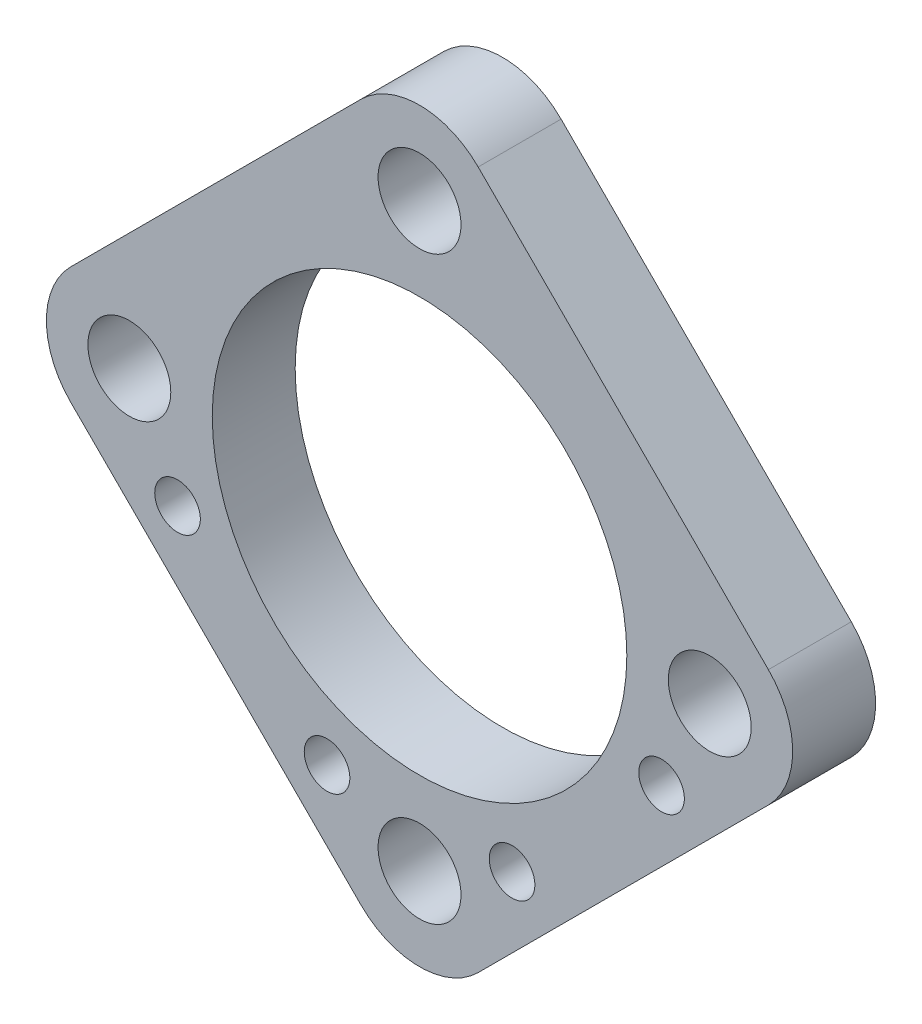
ISO-10303-21;
HEADER;
FILE_DESCRIPTION(('STEP AP214'),'2;1');
FILE_NAME('part.step','',(''),(''),'','','');
FILE_SCHEMA(('AUTOMOTIVE_DESIGN { 1 0 10303 214 1 1 1 1 }'));
ENDSEC;
DATA;
#1=APPLICATION_CONTEXT('core data for automotive mechanical design processes');
#2=APPLICATION_PROTOCOL_DEFINITION('international standard','automotive_design',2000,#1);
#3=PRODUCT_CONTEXT('',#1,'mechanical');
#4=PRODUCT('Part','Part','',(#3));
#5=PRODUCT_RELATED_PRODUCT_CATEGORY('part','',(#4));
#6=PRODUCT_DEFINITION_FORMATION('','',#4);
#7=PRODUCT_DEFINITION_CONTEXT('part definition',#1,'design');
#8=PRODUCT_DEFINITION('design','',#6,#7);
#9=PRODUCT_DEFINITION_SHAPE('','',#8);
#10=(LENGTH_UNIT() NAMED_UNIT(*) SI_UNIT(.MILLI.,.METRE.));
#11=(NAMED_UNIT(*) PLANE_ANGLE_UNIT() SI_UNIT($,.RADIAN.));
#12=(NAMED_UNIT(*) SI_UNIT($,.STERADIAN.) SOLID_ANGLE_UNIT());
#13=UNCERTAINTY_MEASURE_WITH_UNIT(LENGTH_MEASURE(1.E-05),#10,'distance_accuracy_value','');
#14=(GEOMETRIC_REPRESENTATION_CONTEXT(3) GLOBAL_UNCERTAINTY_ASSIGNED_CONTEXT((#13)) GLOBAL_UNIT_ASSIGNED_CONTEXT((#10,
#11,#12)) REPRESENTATION_CONTEXT('',''));
#15=CARTESIAN_POINT('',(0.,0.,0.));
#16=DIRECTION('',(0.,0.,1.));
#17=DIRECTION('',(1.,0.,0.));
#18=AXIS2_PLACEMENT_3D('',#15,#16,#17);
#19=CARTESIAN_POINT('',(24.5710678118655,24.5710678118655,10.));
#20=DIRECTION('',(0.707106781186548,0.707106781186547,0.));
#21=DIRECTION('',(-0.707106781186547,0.707106781186548,0.));
#22=AXIS2_PLACEMENT_3D('',#19,#20,#21);
#23=PLANE('',#22);
#24=DIRECTION('',(0.707106781186547,-0.707106781186548,0.));
#25=VECTOR('',#24,1.);
#26=CARTESIAN_POINT('',(24.5710678118655,24.5710678118655,0.));
#27=LINE('',#26,#25);
#28=CARTESIAN_POINT('',(7.07106781186548,42.0710678118655,0.));
#29=VERTEX_POINT('',#28);
#30=CARTESIAN_POINT('',(42.0710678118655,7.07106781186548,0.));
#31=VERTEX_POINT('',#30);
#32=EDGE_CURVE('E147',#29,#31,#27,.T.);
#33=ORIENTED_EDGE('',*,*,#32,.F.);
#34=DIRECTION('',(0.,0.,-1.));
#35=VECTOR('',#34,1.);
#36=CARTESIAN_POINT('',(7.07106781186548,42.0710678118655,10.));
#37=LINE('',#36,#35);
#38=CARTESIAN_POINT('',(7.07106781186548,42.0710678118655,10.));
#39=VERTEX_POINT('',#38);
#40=EDGE_CURVE('E11',#39,#29,#37,.T.);
#41=ORIENTED_EDGE('',*,*,#40,.F.);
#42=DIRECTION('',(0.707106781186547,-0.707106781186548,0.));
#43=VECTOR('',#42,1.);
#44=CARTESIAN_POINT('',(24.5710678118655,24.5710678118655,10.));
#45=LINE('',#44,#43);
#46=CARTESIAN_POINT('',(42.0710678118655,7.07106781186548,10.));
#47=VERTEX_POINT('',#46);
#48=EDGE_CURVE('E257',#39,#47,#45,.T.);
#49=ORIENTED_EDGE('',*,*,#48,.T.);
#50=DIRECTION('',(0.,0.,-1.));
#51=VECTOR('',#50,1.);
#52=CARTESIAN_POINT('',(42.0710678118655,7.07106781186548,10.));
#53=LINE('',#52,#51);
#54=EDGE_CURVE('E89',#47,#31,#53,.T.);
#55=ORIENTED_EDGE('',*,*,#54,.T.);
#56=EDGE_LOOP('',(#33,#41,#49,#55));
#57=FACE_BOUND('',#56,.T.);
#58=ADVANCED_FACE('F36',(#57),#23,.T.);
#59=CARTESIAN_POINT('',(0.,35.,10.));
#60=DIRECTION('',(0.,0.,-1.));
#61=DIRECTION('',(-1.,0.,0.));
#62=AXIS2_PLACEMENT_3D('',#59,#60,#61);
#63=CYLINDRICAL_SURFACE('',#62,10.);
#64=CARTESIAN_POINT('',(0.,35.,0.));
#65=DIRECTION('',(0.,0.,1.));
#66=DIRECTION('',(1.,0.,0.));
#67=AXIS2_PLACEMENT_3D('',#64,#65,#66);
#68=CIRCLE('',#67,10.);
#69=CARTESIAN_POINT('',(-7.07106781186549,42.0710678118655,0.));
#70=VERTEX_POINT('',#69);
#71=EDGE_CURVE('E150',#29,#70,#68,.T.);
#72=ORIENTED_EDGE('',*,*,#71,.T.);
#73=DIRECTION('',(0.,0.,-1.));
#74=VECTOR('',#73,1.);
#75=CARTESIAN_POINT('',(-7.07106781186549,42.0710678118655,10.));
#76=LINE('',#75,#74);
#77=CARTESIAN_POINT('',(-7.07106781186549,42.0710678118655,10.));
#78=VERTEX_POINT('',#77);
#79=EDGE_CURVE('E46',#78,#70,#76,.T.);
#80=ORIENTED_EDGE('',*,*,#79,.F.);
#81=CARTESIAN_POINT('',(0.,35.,10.));
#82=DIRECTION('',(0.,0.,1.));
#83=DIRECTION('',(1.,0.,0.));
#84=AXIS2_PLACEMENT_3D('',#81,#82,#83);
#85=CIRCLE('',#84,10.);
#86=EDGE_CURVE('E254',#39,#78,#85,.T.);
#87=ORIENTED_EDGE('',*,*,#86,.F.);
#88=ORIENTED_EDGE('',*,*,#40,.T.);
#89=EDGE_LOOP('',(#72,#80,#87,#88));
#90=FACE_BOUND('',#89,.T.);
#91=ADVANCED_FACE('F204',(#90),#63,.T.);
#92=CARTESIAN_POINT('',(-24.5710678118655,24.5710678118655,10.));
#93=DIRECTION('',(-0.707106781186548,0.707106781186548,0.));
#94=DIRECTION('',(-0.707106781186548,-0.707106781186548,0.));
#95=AXIS2_PLACEMENT_3D('',#92,#93,#94);
#96=PLANE('',#95);
#97=DIRECTION('',(0.707106781186548,0.707106781186548,0.));
#98=VECTOR('',#97,1.);
#99=CARTESIAN_POINT('',(-24.5710678118655,24.5710678118655,0.));
#100=LINE('',#99,#98);
#101=CARTESIAN_POINT('',(-42.0710678118655,7.07106781186549,0.));
#102=VERTEX_POINT('',#101);
#103=EDGE_CURVE('E153',#102,#70,#100,.T.);
#104=ORIENTED_EDGE('',*,*,#103,.F.);
#105=DIRECTION('',(0.,0.,-1.));
#106=VECTOR('',#105,1.);
#107=CARTESIAN_POINT('',(-42.0710678118655,7.07106781186549,10.));
#108=LINE('',#107,#106);
#109=CARTESIAN_POINT('',(-42.0710678118655,7.07106781186549,10.));
#110=VERTEX_POINT('',#109);
#111=EDGE_CURVE('E173',#110,#102,#108,.T.);
#112=ORIENTED_EDGE('',*,*,#111,.F.);
#113=DIRECTION('',(0.707106781186548,0.707106781186548,0.));
#114=VECTOR('',#113,1.);
#115=CARTESIAN_POINT('',(-24.5710678118655,24.5710678118655,10.));
#116=LINE('',#115,#114);
#117=EDGE_CURVE('E256',#110,#78,#116,.T.);
#118=ORIENTED_EDGE('',*,*,#117,.T.);
#119=ORIENTED_EDGE('',*,*,#79,.T.);
#120=EDGE_LOOP('',(#104,#112,#118,#119));
#121=FACE_BOUND('',#120,.T.);
#122=ADVANCED_FACE('F209',(#121),#96,.T.);
#123=CARTESIAN_POINT('',(-35.,0.,10.));
#124=DIRECTION('',(0.,0.,-1.));
#125=DIRECTION('',(-1.,0.,0.));
#126=AXIS2_PLACEMENT_3D('',#123,#124,#125);
#127=CYLINDRICAL_SURFACE('',#126,10.);
#128=CARTESIAN_POINT('',(-35.,0.,0.));
#129=DIRECTION('',(0.,0.,1.));
#130=DIRECTION('',(1.,0.,0.));
#131=AXIS2_PLACEMENT_3D('',#128,#129,#130);
#132=CIRCLE('',#131,10.);
#133=CARTESIAN_POINT('',(-42.0710678118655,-7.07106781186549,0.));
#134=VERTEX_POINT('',#133);
#135=EDGE_CURVE('E156',#102,#134,#132,.T.);
#136=ORIENTED_EDGE('',*,*,#135,.T.);
#137=DIRECTION('',(0.,0.,-1.));
#138=VECTOR('',#137,1.);
#139=CARTESIAN_POINT('',(-42.0710678118655,-7.07106781186549,10.));
#140=LINE('',#139,#138);
#141=CARTESIAN_POINT('',(-42.0710678118655,-7.07106781186549,10.));
#142=VERTEX_POINT('',#141);
#143=EDGE_CURVE('E171',#142,#134,#140,.T.);
#144=ORIENTED_EDGE('',*,*,#143,.F.);
#145=CARTESIAN_POINT('',(-35.,0.,10.));
#146=DIRECTION('',(0.,0.,1.));
#147=DIRECTION('',(1.,0.,0.));
#148=AXIS2_PLACEMENT_3D('',#145,#146,#147);
#149=CIRCLE('',#148,10.);
#150=EDGE_CURVE('E267',#110,#142,#149,.T.);
#151=ORIENTED_EDGE('',*,*,#150,.F.);
#152=ORIENTED_EDGE('',*,*,#111,.T.);
#153=EDGE_LOOP('',(#136,#144,#151,#152));
#154=FACE_BOUND('',#153,.T.);
#155=ADVANCED_FACE('F275',(#154),#127,.T.);
#156=CARTESIAN_POINT('',(-24.5710678118655,-24.5710678118655,10.));
#157=DIRECTION('',(-0.707106781186547,-0.707106781186548,0.));
#158=DIRECTION('',(0.707106781186548,-0.707106781186547,0.));
#159=AXIS2_PLACEMENT_3D('',#156,#157,#158);
#160=PLANE('',#159);
#161=DIRECTION('',(-0.707106781186548,0.707106781186547,0.));
#162=VECTOR('',#161,1.);
#163=CARTESIAN_POINT('',(-24.5710678118655,-24.5710678118655,0.));
#164=LINE('',#163,#162);
#165=CARTESIAN_POINT('',(-7.07106781186548,-42.0710678118655,0.));
#166=VERTEX_POINT('',#165);
#167=EDGE_CURVE('E159',#166,#134,#164,.T.);
#168=ORIENTED_EDGE('',*,*,#167,.F.);
#169=DIRECTION('',(0.,0.,-1.));
#170=VECTOR('',#169,1.);
#171=CARTESIAN_POINT('',(-7.07106781186548,-42.0710678118655,10.));
#172=LINE('',#171,#170);
#173=CARTESIAN_POINT('',(-7.07106781186548,-42.0710678118655,10.));
#174=VERTEX_POINT('',#173);
#175=EDGE_CURVE('E125',#174,#166,#172,.T.);
#176=ORIENTED_EDGE('',*,*,#175,.F.);
#177=DIRECTION('',(-0.707106781186548,0.707106781186547,0.));
#178=VECTOR('',#177,1.);
#179=CARTESIAN_POINT('',(-24.5710678118655,-24.5710678118655,10.));
#180=LINE('',#179,#178);
#181=EDGE_CURVE('E114',#174,#142,#180,.T.);
#182=ORIENTED_EDGE('',*,*,#181,.T.);
#183=ORIENTED_EDGE('',*,*,#143,.T.);
#184=EDGE_LOOP('',(#168,#176,#182,#183));
#185=FACE_BOUND('',#184,.T.);
#186=ADVANCED_FACE('F270',(#185),#160,.T.);
#187=CARTESIAN_POINT('',(0.,-35.,10.));
#188=DIRECTION('',(0.,0.,-1.));
#189=DIRECTION('',(-1.,0.,0.));
#190=AXIS2_PLACEMENT_3D('',#187,#188,#189);
#191=CYLINDRICAL_SURFACE('',#190,10.);
#192=CARTESIAN_POINT('',(0.,-35.,0.));
#193=DIRECTION('',(0.,0.,1.));
#194=DIRECTION('',(1.,0.,0.));
#195=AXIS2_PLACEMENT_3D('',#192,#193,#194);
#196=CIRCLE('',#195,10.);
#197=CARTESIAN_POINT('',(7.07106781186547,-42.0710678118655,0.));
#198=VERTEX_POINT('',#197);
#199=EDGE_CURVE('E121',#166,#198,#196,.T.);
#200=ORIENTED_EDGE('',*,*,#199,.T.);
#201=DIRECTION('',(0.,0.,-1.));
#202=VECTOR('',#201,1.);
#203=CARTESIAN_POINT('',(7.07106781186547,-42.0710678118655,10.));
#204=LINE('',#203,#202);
#205=CARTESIAN_POINT('',(7.07106781186547,-42.0710678118655,10.));
#206=VERTEX_POINT('',#205);
#207=EDGE_CURVE('E118',#206,#198,#204,.T.);
#208=ORIENTED_EDGE('',*,*,#207,.F.);
#209=CARTESIAN_POINT('',(0.,-35.,10.));
#210=DIRECTION('',(0.,0.,1.));
#211=DIRECTION('',(1.,0.,0.));
#212=AXIS2_PLACEMENT_3D('',#209,#210,#211);
#213=CIRCLE('',#212,10.);
#214=EDGE_CURVE('E108',#174,#206,#213,.T.);
#215=ORIENTED_EDGE('',*,*,#214,.F.);
#216=ORIENTED_EDGE('',*,*,#175,.T.);
#217=EDGE_LOOP('',(#200,#208,#215,#216));
#218=FACE_BOUND('',#217,.T.);
#219=ADVANCED_FACE('F119',(#218),#191,.T.);
#220=CARTESIAN_POINT('',(24.5710678118655,-24.5710678118655,10.));
#221=DIRECTION('',(0.707106781186548,-0.707106781186547,0.));
#222=DIRECTION('',(0.707106781186547,0.707106781186548,0.));
#223=AXIS2_PLACEMENT_3D('',#220,#221,#222);
#224=PLANE('',#223);
#225=DIRECTION('',(-0.707106781186547,-0.707106781186548,0.));
#226=VECTOR('',#225,1.);
#227=CARTESIAN_POINT('',(24.5710678118655,-24.5710678118655,0.));
#228=LINE('',#227,#226);
#229=CARTESIAN_POINT('',(42.0710678118655,-7.07106781186547,0.));
#230=VERTEX_POINT('',#229);
#231=EDGE_CURVE('E163',#230,#198,#228,.T.);
#232=ORIENTED_EDGE('',*,*,#231,.F.);
#233=DIRECTION('',(0.,0.,-1.));
#234=VECTOR('',#233,1.);
#235=CARTESIAN_POINT('',(42.0710678118655,-7.07106781186547,10.));
#236=LINE('',#235,#234);
#237=CARTESIAN_POINT('',(42.0710678118655,-7.07106781186547,10.));
#238=VERTEX_POINT('',#237);
#239=EDGE_CURVE('E82',#238,#230,#236,.T.);
#240=ORIENTED_EDGE('',*,*,#239,.F.);
#241=DIRECTION('',(-0.707106781186547,-0.707106781186548,0.));
#242=VECTOR('',#241,1.);
#243=CARTESIAN_POINT('',(24.5710678118655,-24.5710678118655,10.));
#244=LINE('',#243,#242);
#245=EDGE_CURVE('E112',#238,#206,#244,.T.);
#246=ORIENTED_EDGE('',*,*,#245,.T.);
#247=ORIENTED_EDGE('',*,*,#207,.T.);
#248=EDGE_LOOP('',(#232,#240,#246,#247));
#249=FACE_BOUND('',#248,.T.);
#250=ADVANCED_FACE('F127',(#249),#224,.T.);
#251=CARTESIAN_POINT('',(0.,0.,10.));
#252=DIRECTION('',(0.,0.,-1.));
#253=DIRECTION('',(-1.,0.,0.));
#254=AXIS2_PLACEMENT_3D('',#251,#252,#253);
#255=CYLINDRICAL_SURFACE('',#254,25.);
#256=CARTESIAN_POINT('',(0.,0.,10.));
#257=DIRECTION('',(0.,0.,1.));
#258=DIRECTION('',(1.,0.,0.));
#259=AXIS2_PLACEMENT_3D('',#256,#257,#258);
#260=CIRCLE('',#259,25.);
#261=CARTESIAN_POINT('',(25.,0.,10.));
#262=VERTEX_POINT('',#261);
#263=EDGE_CURVE('E259',#262,#262,#260,.T.);
#264=ORIENTED_EDGE('',*,*,#263,.T.);
#265=EDGE_LOOP('',(#264));
#266=FACE_BOUND('',#265,.T.);
#267=CARTESIAN_POINT('',(0.,0.,0.));
#268=DIRECTION('',(0.,0.,1.));
#269=DIRECTION('',(1.,0.,0.));
#270=AXIS2_PLACEMENT_3D('',#267,#268,#269);
#271=CIRCLE('',#270,25.);
#272=CARTESIAN_POINT('',(25.,0.,0.));
#273=VERTEX_POINT('',#272);
#274=EDGE_CURVE('E144',#273,#273,#271,.T.);
#275=ORIENTED_EDGE('',*,*,#274,.F.);
#276=EDGE_LOOP('',(#275));
#277=FACE_BOUND('',#276,.T.);
#278=ADVANCED_FACE('F214',(#266,#277),#255,.F.);
#279=CARTESIAN_POINT('',(0.,-35.,10.));
#280=DIRECTION('',(0.,0.,-1.));
#281=DIRECTION('',(-1.,0.,0.));
#282=AXIS2_PLACEMENT_3D('',#279,#280,#281);
#283=CYLINDRICAL_SURFACE('',#282,5.);
#284=CARTESIAN_POINT('',(0.,-35.,10.));
#285=DIRECTION('',(0.,0.,1.));
#286=DIRECTION('',(1.,0.,0.));
#287=AXIS2_PLACEMENT_3D('',#284,#285,#286);
#288=CIRCLE('',#287,5.);
#289=CARTESIAN_POINT('',(5.,-35.,10.));
#290=VERTEX_POINT('',#289);
#291=EDGE_CURVE('E262',#290,#290,#288,.T.);
#292=ORIENTED_EDGE('',*,*,#291,.T.);
#293=EDGE_LOOP('',(#292));
#294=FACE_BOUND('',#293,.T.);
#295=CARTESIAN_POINT('',(0.,-35.,0.));
#296=DIRECTION('',(0.,0.,1.));
#297=DIRECTION('',(1.,0.,0.));
#298=AXIS2_PLACEMENT_3D('',#295,#296,#297);
#299=CIRCLE('',#298,5.);
#300=CARTESIAN_POINT('',(5.,-35.,0.));
#301=VERTEX_POINT('',#300);
#302=EDGE_CURVE('E141',#301,#301,#299,.T.);
#303=ORIENTED_EDGE('',*,*,#302,.F.);
#304=EDGE_LOOP('',(#303));
#305=FACE_BOUND('',#304,.T.);
#306=ADVANCED_FACE('F217',(#294,#305),#283,.F.);
#307=CARTESIAN_POINT('',(35.,0.,10.));
#308=DIRECTION('',(0.,0.,-1.));
#309=DIRECTION('',(-1.,0.,0.));
#310=AXIS2_PLACEMENT_3D('',#307,#308,#309);
#311=CYLINDRICAL_SURFACE('',#310,5.);
#312=CARTESIAN_POINT('',(35.,0.,10.));
#313=DIRECTION('',(0.,0.,1.));
#314=DIRECTION('',(1.,0.,0.));
#315=AXIS2_PLACEMENT_3D('',#312,#313,#314);
#316=CIRCLE('',#315,5.);
#317=CARTESIAN_POINT('',(40.,0.,10.));
#318=VERTEX_POINT('',#317);
#319=EDGE_CURVE('E325',#318,#318,#316,.T.);
#320=ORIENTED_EDGE('',*,*,#319,.T.);
#321=EDGE_LOOP('',(#320));
#322=FACE_BOUND('',#321,.T.);
#323=CARTESIAN_POINT('',(35.,0.,0.));
#324=DIRECTION('',(0.,0.,1.));
#325=DIRECTION('',(1.,0.,0.));
#326=AXIS2_PLACEMENT_3D('',#323,#324,#325);
#327=CIRCLE('',#326,5.);
#328=CARTESIAN_POINT('',(40.,0.,0.));
#329=VERTEX_POINT('',#328);
#330=EDGE_CURVE('E138',#329,#329,#327,.T.);
#331=ORIENTED_EDGE('',*,*,#330,.F.);
#332=EDGE_LOOP('',(#331));
#333=FACE_BOUND('',#332,.T.);
#334=ADVANCED_FACE('F221',(#322,#333),#311,.F.);
#335=CARTESIAN_POINT('',(0.,35.,10.));
#336=DIRECTION('',(0.,0.,-1.));
#337=DIRECTION('',(-1.,0.,0.));
#338=AXIS2_PLACEMENT_3D('',#335,#336,#337);
#339=CYLINDRICAL_SURFACE('',#338,5.);
#340=CARTESIAN_POINT('',(0.,35.,10.));
#341=DIRECTION('',(0.,0.,1.));
#342=DIRECTION('',(1.,0.,0.));
#343=AXIS2_PLACEMENT_3D('',#340,#341,#342);
#344=CIRCLE('',#343,5.);
#345=CARTESIAN_POINT('',(5.,35.,10.));
#346=VERTEX_POINT('',#345);
#347=EDGE_CURVE('E236',#346,#346,#344,.T.);
#348=ORIENTED_EDGE('',*,*,#347,.T.);
#349=EDGE_LOOP('',(#348));
#350=FACE_BOUND('',#349,.T.);
#351=CARTESIAN_POINT('',(0.,35.,0.));
#352=DIRECTION('',(0.,0.,1.));
#353=DIRECTION('',(1.,0.,0.));
#354=AXIS2_PLACEMENT_3D('',#351,#352,#353);
#355=CIRCLE('',#354,5.);
#356=CARTESIAN_POINT('',(5.,35.,0.));
#357=VERTEX_POINT('',#356);
#358=EDGE_CURVE('E135',#357,#357,#355,.T.);
#359=ORIENTED_EDGE('',*,*,#358,.F.);
#360=EDGE_LOOP('',(#359));
#361=FACE_BOUND('',#360,.T.);
#362=ADVANCED_FACE('F224',(#350,#361),#339,.F.);
#363=CARTESIAN_POINT('',(-35.,0.,10.));
#364=DIRECTION('',(0.,0.,-1.));
#365=DIRECTION('',(-1.,0.,0.));
#366=AXIS2_PLACEMENT_3D('',#363,#364,#365);
#367=CYLINDRICAL_SURFACE('',#366,5.);
#368=CARTESIAN_POINT('',(-35.,0.,10.));
#369=DIRECTION('',(0.,0.,1.));
#370=DIRECTION('',(1.,0.,0.));
#371=AXIS2_PLACEMENT_3D('',#368,#369,#370);
#372=CIRCLE('',#371,5.);
#373=CARTESIAN_POINT('',(-30.,0.,10.));
#374=VERTEX_POINT('',#373);
#375=EDGE_CURVE('E167',#374,#374,#372,.T.);
#376=ORIENTED_EDGE('',*,*,#375,.T.);
#377=EDGE_LOOP('',(#376));
#378=FACE_BOUND('',#377,.T.);
#379=CARTESIAN_POINT('',(-35.,0.,0.));
#380=DIRECTION('',(0.,0.,1.));
#381=DIRECTION('',(1.,0.,0.));
#382=AXIS2_PLACEMENT_3D('',#379,#380,#381);
#383=CIRCLE('',#382,5.);
#384=CARTESIAN_POINT('',(-30.,0.,0.));
#385=VERTEX_POINT('',#384);
#386=EDGE_CURVE('E132',#385,#385,#383,.T.);
#387=ORIENTED_EDGE('',*,*,#386,.F.);
#388=EDGE_LOOP('',(#387));
#389=FACE_BOUND('',#388,.T.);
#390=ADVANCED_FACE('F38',(#378,#389),#367,.F.);
#391=CARTESIAN_POINT('',(35.,0.,10.));
#392=DIRECTION('',(0.,0.,-1.));
#393=DIRECTION('',(-1.,0.,0.));
#394=AXIS2_PLACEMENT_3D('',#391,#392,#393);
#395=CYLINDRICAL_SURFACE('',#394,10.);
#396=CARTESIAN_POINT('',(35.,0.,0.));
#397=DIRECTION('',(0.,0.,1.));
#398=DIRECTION('',(1.,0.,0.));
#399=AXIS2_PLACEMENT_3D('',#396,#397,#398);
#400=CIRCLE('',#399,10.);
#401=EDGE_CURVE('E165',#230,#31,#400,.T.);
#402=ORIENTED_EDGE('',*,*,#401,.T.);
#403=ORIENTED_EDGE('',*,*,#54,.F.);
#404=CARTESIAN_POINT('',(35.,0.,10.));
#405=DIRECTION('',(0.,0.,1.));
#406=DIRECTION('',(1.,0.,0.));
#407=AXIS2_PLACEMENT_3D('',#404,#405,#406);
#408=CIRCLE('',#407,10.);
#409=EDGE_CURVE('E55',#238,#47,#408,.T.);
#410=ORIENTED_EDGE('',*,*,#409,.F.);
#411=ORIENTED_EDGE('',*,*,#239,.T.);
#412=EDGE_LOOP('',(#402,#403,#410,#411));
#413=FACE_BOUND('',#412,.T.);
#414=ADVANCED_FACE('F231',(#413),#395,.T.);
#415=CARTESIAN_POINT('',(0.,0.,10.));
#416=DIRECTION('',(0.,0.,1.));
#417=DIRECTION('',(1.,0.,0.));
#418=AXIS2_PLACEMENT_3D('',#415,#416,#417);
#419=PLANE('',#418);
#420=CARTESIAN_POINT('',(-29.1880771697494,-11.468777079743,10.));
#421=DIRECTION('',(0.,0.,-1.));
#422=DIRECTION('',(-1.,0.,0.));
#423=AXIS2_PLACEMENT_3D('',#420,#421,#422);
#424=CIRCLE('',#423,2.74999999999999);
#425=CARTESIAN_POINT('',(-31.9380771697493,-11.468777079743,10.));
#426=VERTEX_POINT('',#425);
#427=EDGE_CURVE('E180',#426,#426,#424,.T.);
#428=ORIENTED_EDGE('',*,*,#427,.T.);
#429=EDGE_LOOP('',(#428));
#430=FACE_BOUND('',#429,.T.);
#431=CARTESIAN_POINT('',(-11.1568542494924,-29.5,10.));
#432=DIRECTION('',(0.,0.,-1.));
#433=DIRECTION('',(-1.,0.,0.));
#434=AXIS2_PLACEMENT_3D('',#431,#432,#433);
#435=CIRCLE('',#434,2.75);
#436=CARTESIAN_POINT('',(-13.9068542494924,-29.5,10.));
#437=VERTEX_POINT('',#436);
#438=EDGE_CURVE('E313',#437,#437,#435,.T.);
#439=ORIENTED_EDGE('',*,*,#438,.T.);
#440=EDGE_LOOP('',(#439));
#441=FACE_BOUND('',#440,.T.);
#442=CARTESIAN_POINT('',(11.1568542494924,-29.5,10.));
#443=DIRECTION('',(0.,0.,-1.));
#444=DIRECTION('',(-1.,0.,0.));
#445=AXIS2_PLACEMENT_3D('',#442,#443,#444);
#446=CIRCLE('',#445,2.75);
#447=CARTESIAN_POINT('',(8.40685424949239,-29.5,10.));
#448=VERTEX_POINT('',#447);
#449=EDGE_CURVE('E303',#448,#448,#446,.T.);
#450=ORIENTED_EDGE('',*,*,#449,.T.);
#451=EDGE_LOOP('',(#450));
#452=FACE_BOUND('',#451,.T.);
#453=CARTESIAN_POINT('',(29.1880771697493,-11.468777079743,10.));
#454=DIRECTION('',(0.,0.,-1.));
#455=DIRECTION('',(-1.,0.,0.));
#456=AXIS2_PLACEMENT_3D('',#453,#454,#455);
#457=CIRCLE('',#456,2.74999999999999);
#458=CARTESIAN_POINT('',(26.4380771697493,-11.468777079743,10.));
#459=VERTEX_POINT('',#458);
#460=EDGE_CURVE('E314',#459,#459,#457,.T.);
#461=ORIENTED_EDGE('',*,*,#460,.T.);
#462=EDGE_LOOP('',(#461));
#463=FACE_BOUND('',#462,.T.);
#464=ORIENTED_EDGE('',*,*,#375,.F.);
#465=EDGE_LOOP('',(#464));
#466=FACE_BOUND('',#465,.T.);
#467=ORIENTED_EDGE('',*,*,#347,.F.);
#468=EDGE_LOOP('',(#467));
#469=FACE_BOUND('',#468,.T.);
#470=ORIENTED_EDGE('',*,*,#319,.F.);
#471=EDGE_LOOP('',(#470));
#472=FACE_BOUND('',#471,.T.);
#473=ORIENTED_EDGE('',*,*,#291,.F.);
#474=EDGE_LOOP('',(#473));
#475=FACE_BOUND('',#474,.T.);
#476=ORIENTED_EDGE('',*,*,#263,.F.);
#477=EDGE_LOOP('',(#476));
#478=FACE_BOUND('',#477,.T.);
#479=ORIENTED_EDGE('',*,*,#48,.F.);
#480=ORIENTED_EDGE('',*,*,#86,.T.);
#481=ORIENTED_EDGE('',*,*,#117,.F.);
#482=ORIENTED_EDGE('',*,*,#150,.T.);
#483=ORIENTED_EDGE('',*,*,#181,.F.);
#484=ORIENTED_EDGE('',*,*,#214,.T.);
#485=ORIENTED_EDGE('',*,*,#245,.F.);
#486=ORIENTED_EDGE('',*,*,#409,.T.);
#487=EDGE_LOOP('',(#479,#480,#481,#482,#483,#484,#485,#486));
#488=FACE_BOUND('',#487,.T.);
#489=ADVANCED_FACE('F110',(#430,#441,#452,#463,#466,#469,#472,#475,#478,#488),#419,.T.);
#490=CARTESIAN_POINT('',(0.,0.,0.));
#491=DIRECTION('',(0.,0.,1.));
#492=DIRECTION('',(1.,0.,0.));
#493=AXIS2_PLACEMENT_3D('',#490,#491,#492);
#494=PLANE('',#493);
#495=CARTESIAN_POINT('',(-29.1880771697494,-11.468777079743,0.));
#496=DIRECTION('',(0.,0.,1.));
#497=DIRECTION('',(1.,0.,0.));
#498=AXIS2_PLACEMENT_3D('',#495,#496,#497);
#499=CIRCLE('',#498,2.74999999999999);
#500=CARTESIAN_POINT('',(-26.4380771697494,-11.468777079743,0.));
#501=VERTEX_POINT('',#500);
#502=EDGE_CURVE('E40',#501,#501,#499,.T.);
#503=ORIENTED_EDGE('',*,*,#502,.T.);
#504=EDGE_LOOP('',(#503));
#505=FACE_BOUND('',#504,.T.);
#506=CARTESIAN_POINT('',(-11.1568542494924,-29.5,0.));
#507=DIRECTION('',(0.,0.,1.));
#508=DIRECTION('',(1.,0.,0.));
#509=AXIS2_PLACEMENT_3D('',#506,#507,#508);
#510=CIRCLE('',#509,2.75);
#511=CARTESIAN_POINT('',(-8.4068542494924,-29.5,0.));
#512=VERTEX_POINT('',#511);
#513=EDGE_CURVE('E182',#512,#512,#510,.T.);
#514=ORIENTED_EDGE('',*,*,#513,.T.);
#515=EDGE_LOOP('',(#514));
#516=FACE_BOUND('',#515,.T.);
#517=CARTESIAN_POINT('',(11.1568542494924,-29.5,0.));
#518=DIRECTION('',(0.,0.,1.));
#519=DIRECTION('',(1.,0.,0.));
#520=AXIS2_PLACEMENT_3D('',#517,#518,#519);
#521=CIRCLE('',#520,2.75);
#522=CARTESIAN_POINT('',(13.9068542494924,-29.5,0.));
#523=VERTEX_POINT('',#522);
#524=EDGE_CURVE('E179',#523,#523,#521,.T.);
#525=ORIENTED_EDGE('',*,*,#524,.T.);
#526=EDGE_LOOP('',(#525));
#527=FACE_BOUND('',#526,.T.);
#528=CARTESIAN_POINT('',(29.1880771697493,-11.468777079743,0.));
#529=DIRECTION('',(0.,0.,1.));
#530=DIRECTION('',(1.,0.,0.));
#531=AXIS2_PLACEMENT_3D('',#528,#529,#530);
#532=CIRCLE('',#531,2.74999999999999);
#533=CARTESIAN_POINT('',(31.9380771697493,-11.468777079743,0.));
#534=VERTEX_POINT('',#533);
#535=EDGE_CURVE('E176',#534,#534,#532,.T.);
#536=ORIENTED_EDGE('',*,*,#535,.T.);
#537=EDGE_LOOP('',(#536));
#538=FACE_BOUND('',#537,.T.);
#539=ORIENTED_EDGE('',*,*,#386,.T.);
#540=EDGE_LOOP('',(#539));
#541=FACE_BOUND('',#540,.T.);
#542=ORIENTED_EDGE('',*,*,#358,.T.);
#543=EDGE_LOOP('',(#542));
#544=FACE_BOUND('',#543,.T.);
#545=ORIENTED_EDGE('',*,*,#330,.T.);
#546=EDGE_LOOP('',(#545));
#547=FACE_BOUND('',#546,.T.);
#548=ORIENTED_EDGE('',*,*,#302,.T.);
#549=EDGE_LOOP('',(#548));
#550=FACE_BOUND('',#549,.T.);
#551=ORIENTED_EDGE('',*,*,#274,.T.);
#552=EDGE_LOOP('',(#551));
#553=FACE_BOUND('',#552,.T.);
#554=ORIENTED_EDGE('',*,*,#32,.T.);
#555=ORIENTED_EDGE('',*,*,#401,.F.);
#556=ORIENTED_EDGE('',*,*,#231,.T.);
#557=ORIENTED_EDGE('',*,*,#199,.F.);
#558=ORIENTED_EDGE('',*,*,#167,.T.);
#559=ORIENTED_EDGE('',*,*,#135,.F.);
#560=ORIENTED_EDGE('',*,*,#103,.T.);
#561=ORIENTED_EDGE('',*,*,#71,.F.);
#562=EDGE_LOOP('',(#554,#555,#556,#557,#558,#559,#560,#561));
#563=FACE_BOUND('',#562,.T.);
#564=ADVANCED_FACE('F189',(#505,#516,#527,#538,#541,#544,#547,#550,#553,#563),#494,.F.);
#565=CARTESIAN_POINT('',(29.1880771697493,-11.468777079743,10.));
#566=DIRECTION('',(0.,0.,-1.));
#567=DIRECTION('',(-1.,0.,0.));
#568=AXIS2_PLACEMENT_3D('',#565,#566,#567);
#569=CYLINDRICAL_SURFACE('',#568,2.74999999999999);
#570=ORIENTED_EDGE('',*,*,#460,.F.);
#571=EDGE_LOOP('',(#570));
#572=FACE_BOUND('',#571,.T.);
#573=ORIENTED_EDGE('',*,*,#535,.F.);
#574=EDGE_LOOP('',(#573));
#575=FACE_BOUND('',#574,.T.);
#576=ADVANCED_FACE('F241',(#572,#575),#569,.F.);
#577=CARTESIAN_POINT('',(11.1568542494924,-29.5,10.));
#578=DIRECTION('',(0.,0.,-1.));
#579=DIRECTION('',(-1.,0.,0.));
#580=AXIS2_PLACEMENT_3D('',#577,#578,#579);
#581=CYLINDRICAL_SURFACE('',#580,2.75);
#582=ORIENTED_EDGE('',*,*,#449,.F.);
#583=EDGE_LOOP('',(#582));
#584=FACE_BOUND('',#583,.T.);
#585=ORIENTED_EDGE('',*,*,#524,.F.);
#586=EDGE_LOOP('',(#585));
#587=FACE_BOUND('',#586,.T.);
#588=ADVANCED_FACE('F199',(#584,#587),#581,.F.);
#589=CARTESIAN_POINT('',(-11.1568542494924,-29.5,10.));
#590=DIRECTION('',(0.,0.,-1.));
#591=DIRECTION('',(-1.,0.,0.));
#592=AXIS2_PLACEMENT_3D('',#589,#590,#591);
#593=CYLINDRICAL_SURFACE('',#592,2.75);
#594=ORIENTED_EDGE('',*,*,#438,.F.);
#595=EDGE_LOOP('',(#594));
#596=FACE_BOUND('',#595,.T.);
#597=ORIENTED_EDGE('',*,*,#513,.F.);
#598=EDGE_LOOP('',(#597));
#599=FACE_BOUND('',#598,.T.);
#600=ADVANCED_FACE('F193',(#596,#599),#593,.F.);
#601=CARTESIAN_POINT('',(-29.1880771697494,-11.468777079743,10.));
#602=DIRECTION('',(0.,0.,-1.));
#603=DIRECTION('',(-1.,0.,0.));
#604=AXIS2_PLACEMENT_3D('',#601,#602,#603);
#605=CYLINDRICAL_SURFACE('',#604,2.74999999999999);
#606=ORIENTED_EDGE('',*,*,#427,.F.);
#607=EDGE_LOOP('',(#606));
#608=FACE_BOUND('',#607,.T.);
#609=ORIENTED_EDGE('',*,*,#502,.F.);
#610=EDGE_LOOP('',(#609));
#611=FACE_BOUND('',#610,.T.);
#612=ADVANCED_FACE('F191',(#608,#611),#605,.F.);
#613=CLOSED_SHELL('',(#58,#91,#122,#155,#186,#219,#250,#278,#306,#334,#362,#390,#414,#489,#564,
#576,#588,#600,#612));
#614=MANIFOLD_SOLID_BREP('B2',#613);
#615=ADVANCED_BREP_SHAPE_REPRESENTATION('',(#18,#614),#14);
#616=SHAPE_DEFINITION_REPRESENTATION(#9,#615);
ENDSEC;
END-ISO-10303-21;
